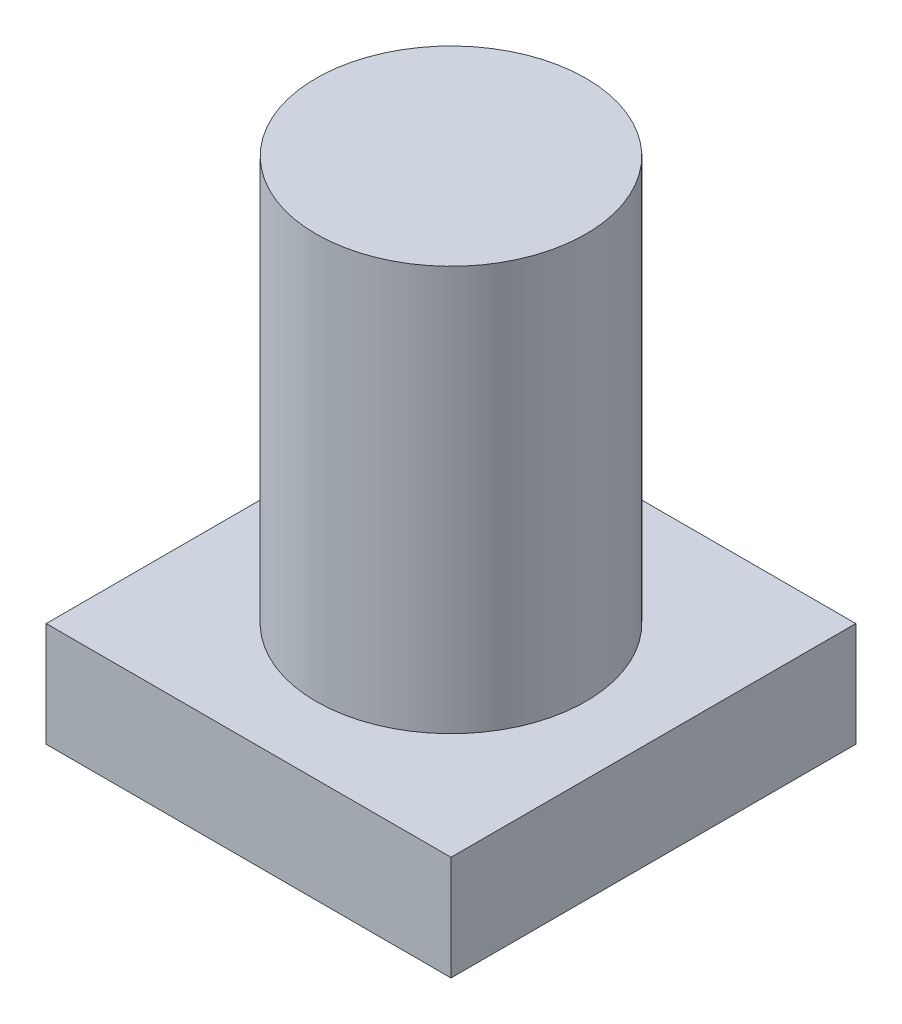
ISO-10303-21;
HEADER;
FILE_DESCRIPTION(('STEP AP214'),'2;1');
FILE_NAME('part.step','',(''),(''),'','','');
FILE_SCHEMA(('AUTOMOTIVE_DESIGN { 1 0 10303 214 1 1 1 1 }'));
ENDSEC;
DATA;
#1=APPLICATION_CONTEXT('core data for automotive mechanical design processes');
#2=APPLICATION_PROTOCOL_DEFINITION('international standard','automotive_design',2000,#1);
#3=PRODUCT_CONTEXT('',#1,'mechanical');
#4=PRODUCT('Part','Part','',(#3));
#5=PRODUCT_RELATED_PRODUCT_CATEGORY('part','',(#4));
#6=PRODUCT_DEFINITION_FORMATION('','',#4);
#7=PRODUCT_DEFINITION_CONTEXT('part definition',#1,'design');
#8=PRODUCT_DEFINITION('design','',#6,#7);
#9=PRODUCT_DEFINITION_SHAPE('','',#8);
#10=(LENGTH_UNIT() NAMED_UNIT(*) SI_UNIT(.MILLI.,.METRE.));
#11=(NAMED_UNIT(*) PLANE_ANGLE_UNIT() SI_UNIT($,.RADIAN.));
#12=(NAMED_UNIT(*) SI_UNIT($,.STERADIAN.) SOLID_ANGLE_UNIT());
#13=UNCERTAINTY_MEASURE_WITH_UNIT(LENGTH_MEASURE(1.E-05),#10,'distance_accuracy_value','');
#14=(GEOMETRIC_REPRESENTATION_CONTEXT(3) GLOBAL_UNCERTAINTY_ASSIGNED_CONTEXT((#13)) GLOBAL_UNIT_ASSIGNED_CONTEXT((#10,
#11,#12)) REPRESENTATION_CONTEXT('',''));
#15=CARTESIAN_POINT('',(0.,0.,0.));
#16=DIRECTION('',(0.,0.,1.));
#17=DIRECTION('',(1.,0.,0.));
#18=AXIS2_PLACEMENT_3D('',#15,#16,#17);
#19=CARTESIAN_POINT('',(-6.,3.1,-6.));
#20=DIRECTION('',(0.,1.,0.));
#21=DIRECTION('',(0.,0.,1.));
#22=AXIS2_PLACEMENT_3D('',#19,#20,#21);
#23=PLANE('',#22);
#24=DIRECTION('',(0.,0.,1.));
#25=VECTOR('',#24,1.);
#26=CARTESIAN_POINT('',(-6.,3.1,-6.));
#27=LINE('',#26,#25);
#28=CARTESIAN_POINT('',(-6.,3.1,-6.));
#29=VERTEX_POINT('',#28);
#30=CARTESIAN_POINT('',(-6.,3.1,6.));
#31=VERTEX_POINT('',#30);
#32=EDGE_CURVE('E101',#29,#31,#27,.T.);
#33=ORIENTED_EDGE('',*,*,#32,.T.);
#34=DIRECTION('',(1.,0.,0.));
#35=VECTOR('',#34,1.);
#36=CARTESIAN_POINT('',(-6.,3.1,6.));
#37=LINE('',#36,#35);
#38=CARTESIAN_POINT('',(6.00000000000003,3.1,6.));
#39=VERTEX_POINT('',#38);
#40=EDGE_CURVE('E86',#31,#39,#37,.T.);
#41=ORIENTED_EDGE('',*,*,#40,.T.);
#42=DIRECTION('',(0.,0.,-1.));
#43=VECTOR('',#42,1.);
#44=CARTESIAN_POINT('',(6.,3.1,-6.));
#45=LINE('',#44,#43);
#46=CARTESIAN_POINT('',(6.,3.1,-6.));
#47=VERTEX_POINT('',#46);
#48=EDGE_CURVE('E53',#39,#47,#45,.T.);
#49=ORIENTED_EDGE('',*,*,#48,.T.);
#50=DIRECTION('',(-1.,0.,0.));
#51=VECTOR('',#50,1.);
#52=CARTESIAN_POINT('',(-6.,3.1,-6.));
#53=LINE('',#52,#51);
#54=EDGE_CURVE('E48',#47,#29,#53,.T.);
#55=ORIENTED_EDGE('',*,*,#54,.T.);
#56=EDGE_LOOP('',(#33,#41,#49,#55));
#57=FACE_BOUND('',#56,.T.);
#58=CARTESIAN_POINT('',(0.,3.1,0.));
#59=DIRECTION('',(0.,1.,0.));
#60=DIRECTION('',(0.,0.,1.));
#61=AXIS2_PLACEMENT_3D('',#58,#59,#60);
#62=CIRCLE('',#61,4.);
#63=CARTESIAN_POINT('',(0.,3.1,4.));
#64=VERTEX_POINT('',#63);
#65=EDGE_CURVE('E94',#64,#64,#62,.T.);
#66=ORIENTED_EDGE('',*,*,#65,.F.);
#67=EDGE_LOOP('',(#66));
#68=FACE_BOUND('',#67,.T.);
#69=ADVANCED_FACE('F33',(#57,#68),#23,.T.);
#70=CARTESIAN_POINT('',(-6.,3.1,-6.));
#71=DIRECTION('',(1.,0.,0.));
#72=DIRECTION('',(0.,0.,-1.));
#73=AXIS2_PLACEMENT_3D('',#70,#71,#72);
#74=PLANE('',#73);
#75=DIRECTION('',(0.,0.,1.));
#76=VECTOR('',#75,1.);
#77=CARTESIAN_POINT('',(-6.,0.,-6.));
#78=LINE('',#77,#76);
#79=CARTESIAN_POINT('',(-6.,0.,-6.));
#80=VERTEX_POINT('',#79);
#81=CARTESIAN_POINT('',(-6.,0.,6.));
#82=VERTEX_POINT('',#81);
#83=EDGE_CURVE('E78',#80,#82,#78,.T.);
#84=ORIENTED_EDGE('',*,*,#83,.T.);
#85=DIRECTION('',(0.,-1.,0.));
#86=VECTOR('',#85,1.);
#87=CARTESIAN_POINT('',(-6.,3.1,6.));
#88=LINE('',#87,#86);
#89=EDGE_CURVE('E11',#31,#82,#88,.T.);
#90=ORIENTED_EDGE('',*,*,#89,.F.);
#91=ORIENTED_EDGE('',*,*,#32,.F.);
#92=DIRECTION('',(0.,-1.,0.));
#93=VECTOR('',#92,1.);
#94=CARTESIAN_POINT('',(-6.,3.1,-6.));
#95=LINE('',#94,#93);
#96=EDGE_CURVE('E90',#29,#80,#95,.T.);
#97=ORIENTED_EDGE('',*,*,#96,.T.);
#98=EDGE_LOOP('',(#84,#90,#91,#97));
#99=FACE_BOUND('',#98,.T.);
#100=ADVANCED_FACE('F35',(#99),#74,.F.);
#101=CARTESIAN_POINT('',(-6.,3.1,6.));
#102=DIRECTION('',(0.,0.,-1.));
#103=DIRECTION('',(-1.,0.,0.));
#104=AXIS2_PLACEMENT_3D('',#101,#102,#103);
#105=PLANE('',#104);
#106=DIRECTION('',(1.,0.,0.));
#107=VECTOR('',#106,1.);
#108=CARTESIAN_POINT('',(-6.,0.,6.));
#109=LINE('',#108,#107);
#110=CARTESIAN_POINT('',(6.00000000000003,0.,6.));
#111=VERTEX_POINT('',#110);
#112=EDGE_CURVE('E74',#82,#111,#109,.T.);
#113=ORIENTED_EDGE('',*,*,#112,.T.);
#114=DIRECTION('',(0.,-1.,0.));
#115=VECTOR('',#114,1.);
#116=CARTESIAN_POINT('',(6.00000000000003,3.1,6.));
#117=LINE('',#116,#115);
#118=EDGE_CURVE('E41',#39,#111,#117,.T.);
#119=ORIENTED_EDGE('',*,*,#118,.F.);
#120=ORIENTED_EDGE('',*,*,#40,.F.);
#121=ORIENTED_EDGE('',*,*,#89,.T.);
#122=EDGE_LOOP('',(#113,#119,#120,#121));
#123=FACE_BOUND('',#122,.T.);
#124=ADVANCED_FACE('F85',(#123),#105,.F.);
#125=CARTESIAN_POINT('',(6.,3.1,-6.));
#126=DIRECTION('',(-1.,0.,0.));
#127=DIRECTION('',(0.,0.,1.));
#128=AXIS2_PLACEMENT_3D('',#125,#126,#127);
#129=PLANE('',#128);
#130=DIRECTION('',(0.,0.,-1.));
#131=VECTOR('',#130,1.);
#132=CARTESIAN_POINT('',(6.,0.,-6.));
#133=LINE('',#132,#131);
#134=CARTESIAN_POINT('',(6.,0.,-6.));
#135=VERTEX_POINT('',#134);
#136=EDGE_CURVE('E79',#111,#135,#133,.T.);
#137=ORIENTED_EDGE('',*,*,#136,.T.);
#138=DIRECTION('',(0.,-1.,0.));
#139=VECTOR('',#138,1.);
#140=CARTESIAN_POINT('',(6.,3.1,-6.));
#141=LINE('',#140,#139);
#142=EDGE_CURVE('E107',#47,#135,#141,.T.);
#143=ORIENTED_EDGE('',*,*,#142,.F.);
#144=ORIENTED_EDGE('',*,*,#48,.F.);
#145=ORIENTED_EDGE('',*,*,#118,.T.);
#146=EDGE_LOOP('',(#137,#143,#144,#145));
#147=FACE_BOUND('',#146,.T.);
#148=ADVANCED_FACE('F110',(#147),#129,.F.);
#149=CARTESIAN_POINT('',(-6.,3.1,-6.));
#150=DIRECTION('',(0.,0.,1.));
#151=DIRECTION('',(1.,0.,0.));
#152=AXIS2_PLACEMENT_3D('',#149,#150,#151);
#153=PLANE('',#152);
#154=DIRECTION('',(-1.,0.,0.));
#155=VECTOR('',#154,1.);
#156=CARTESIAN_POINT('',(-6.,0.,-6.));
#157=LINE('',#156,#155);
#158=EDGE_CURVE('E99',#135,#80,#157,.T.);
#159=ORIENTED_EDGE('',*,*,#158,.T.);
#160=ORIENTED_EDGE('',*,*,#96,.F.);
#161=ORIENTED_EDGE('',*,*,#54,.F.);
#162=ORIENTED_EDGE('',*,*,#142,.T.);
#163=EDGE_LOOP('',(#159,#160,#161,#162));
#164=FACE_BOUND('',#163,.T.);
#165=ADVANCED_FACE('F112',(#164),#153,.F.);
#166=CARTESIAN_POINT('',(-6.,0.,-6.));
#167=DIRECTION('',(0.,1.,0.));
#168=DIRECTION('',(0.,0.,1.));
#169=AXIS2_PLACEMENT_3D('',#166,#167,#168);
#170=PLANE('',#169);
#171=ORIENTED_EDGE('',*,*,#83,.F.);
#172=ORIENTED_EDGE('',*,*,#158,.F.);
#173=ORIENTED_EDGE('',*,*,#136,.F.);
#174=ORIENTED_EDGE('',*,*,#112,.F.);
#175=EDGE_LOOP('',(#171,#172,#173,#174));
#176=FACE_BOUND('',#175,.T.);
#177=ADVANCED_FACE('F75',(#176),#170,.F.);
#178=CARTESIAN_POINT('',(0.,15.1,0.));
#179=DIRECTION('',(0.,-1.,0.));
#180=DIRECTION('',(0.,0.,-1.));
#181=AXIS2_PLACEMENT_3D('',#178,#179,#180);
#182=CYLINDRICAL_SURFACE('',#181,4.);
#183=CARTESIAN_POINT('',(0.,15.1,0.));
#184=DIRECTION('',(0.,1.,0.));
#185=DIRECTION('',(0.,0.,1.));
#186=AXIS2_PLACEMENT_3D('',#183,#184,#185);
#187=CIRCLE('',#186,4.);
#188=CARTESIAN_POINT('',(0.,15.1,4.));
#189=VERTEX_POINT('',#188);
#190=EDGE_CURVE('E91',#189,#189,#187,.T.);
#191=ORIENTED_EDGE('',*,*,#190,.F.);
#192=EDGE_LOOP('',(#191));
#193=FACE_BOUND('',#192,.T.);
#194=ORIENTED_EDGE('',*,*,#65,.T.);
#195=EDGE_LOOP('',(#194));
#196=FACE_BOUND('',#195,.T.);
#197=ADVANCED_FACE('F119',(#193,#196),#182,.T.);
#198=CARTESIAN_POINT('',(0.,15.1,0.));
#199=DIRECTION('',(0.,1.,0.));
#200=DIRECTION('',(0.,0.,1.));
#201=AXIS2_PLACEMENT_3D('',#198,#199,#200);
#202=PLANE('',#201);
#203=ORIENTED_EDGE('',*,*,#190,.T.);
#204=EDGE_LOOP('',(#203));
#205=FACE_BOUND('',#204,.T.);
#206=ADVANCED_FACE('F121',(#205),#202,.T.);
#207=CLOSED_SHELL('',(#69,#100,#124,#148,#165,#177,#197,#206));
#208=MANIFOLD_SOLID_BREP('B2',#207);
#209=ADVANCED_BREP_SHAPE_REPRESENTATION('',(#18,#208),#14);
#210=SHAPE_DEFINITION_REPRESENTATION(#9,#209);
ENDSEC;
END-ISO-10303-21;
